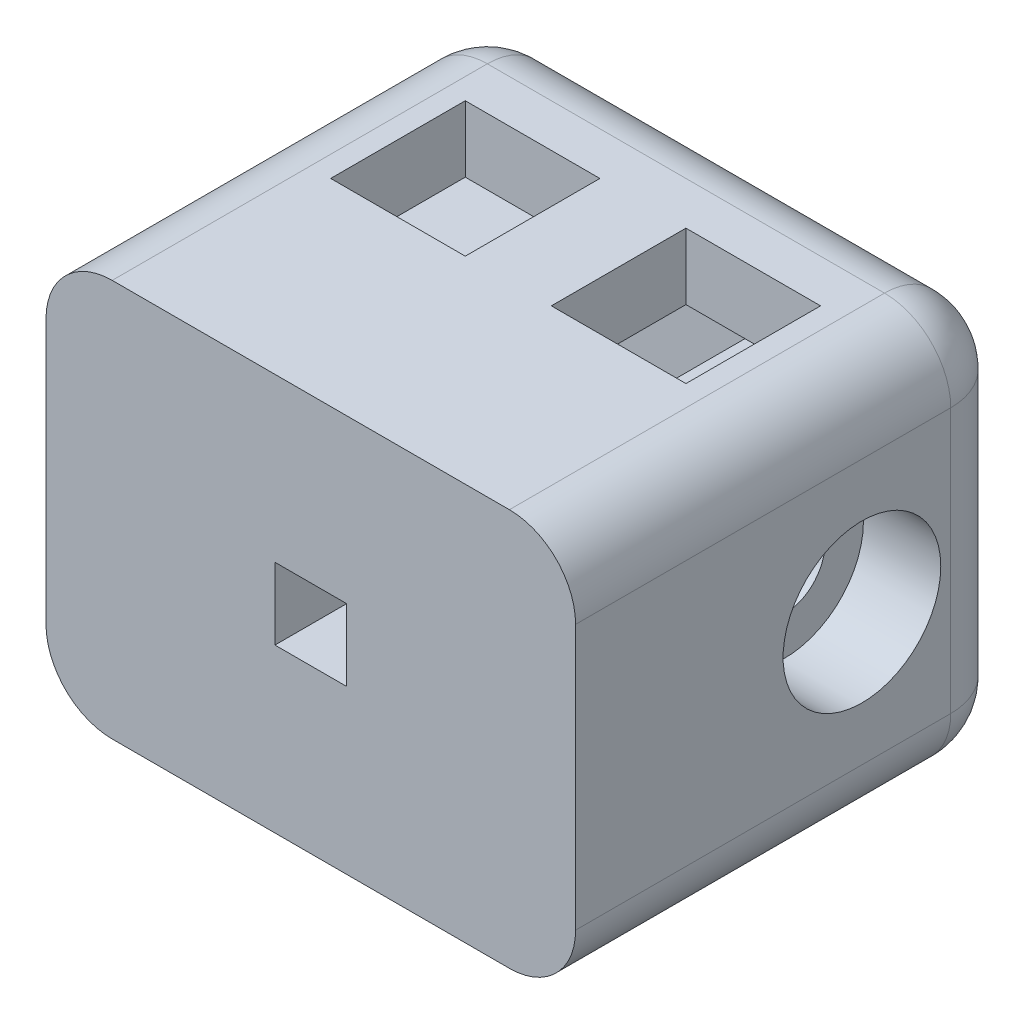
ISO-10303-21;
HEADER;
FILE_DESCRIPTION(('STEP AP214'),'2;1');
FILE_NAME('part.step','',(''),(''),'','','');
FILE_SCHEMA(('AUTOMOTIVE_DESIGN { 1 0 10303 214 1 1 1 1 }'));
ENDSEC;
DATA;
#1=APPLICATION_CONTEXT('core data for automotive mechanical design processes');
#2=APPLICATION_PROTOCOL_DEFINITION('international standard','automotive_design',2000,#1);
#3=PRODUCT_CONTEXT('',#1,'mechanical');
#4=PRODUCT('Part','Part','',(#3));
#5=PRODUCT_RELATED_PRODUCT_CATEGORY('part','',(#4));
#6=PRODUCT_DEFINITION_FORMATION('','',#4);
#7=PRODUCT_DEFINITION_CONTEXT('part definition',#1,'design');
#8=PRODUCT_DEFINITION('design','',#6,#7);
#9=PRODUCT_DEFINITION_SHAPE('','',#8);
#10=(LENGTH_UNIT() NAMED_UNIT(*) SI_UNIT(.MILLI.,.METRE.));
#11=(NAMED_UNIT(*) PLANE_ANGLE_UNIT() SI_UNIT($,.RADIAN.));
#12=(NAMED_UNIT(*) SI_UNIT($,.STERADIAN.) SOLID_ANGLE_UNIT());
#13=UNCERTAINTY_MEASURE_WITH_UNIT(LENGTH_MEASURE(1.E-05),#10,'distance_accuracy_value','');
#14=(GEOMETRIC_REPRESENTATION_CONTEXT(3) GLOBAL_UNCERTAINTY_ASSIGNED_CONTEXT((#13)) GLOBAL_UNIT_ASSIGNED_CONTEXT((#10,
#11,#12)) REPRESENTATION_CONTEXT('',''));
#15=CARTESIAN_POINT('',(0.,0.,0.));
#16=DIRECTION('',(0.,0.,1.));
#17=DIRECTION('',(1.,0.,0.));
#18=AXIS2_PLACEMENT_3D('',#15,#16,#17);
#19=CARTESIAN_POINT('',(0.,6.,0.));
#20=DIRECTION('',(0.,-1.,0.));
#21=DIRECTION('',(0.,0.,-1.));
#22=AXIS2_PLACEMENT_3D('',#19,#20,#21);
#23=PLANE('',#22);
#24=DIRECTION('',(0.,0.,1.));
#25=VECTOR('',#24,1.);
#26=CARTESIAN_POINT('',(-4.625,6.,2.95));
#27=LINE('',#26,#25);
#28=CARTESIAN_POINT('',(-4.625,6.,4.95));
#29=VERTEX_POINT('',#28);
#30=CARTESIAN_POINT('',(-4.625,6.,11.05));
#31=VERTEX_POINT('',#30);
#32=EDGE_CURVE('E231',#29,#31,#27,.T.);
#33=ORIENTED_EDGE('',*,*,#32,.F.);
#34=DIRECTION('',(-1.,0.,0.));
#35=VECTOR('',#34,1.);
#36=CARTESIAN_POINT('',(-8.05,6.,4.95));
#37=LINE('',#36,#35);
#38=CARTESIAN_POINT('',(-8.05,6.,4.95));
#39=VERTEX_POINT('',#38);
#40=EDGE_CURVE('E279',#29,#39,#37,.T.);
#41=ORIENTED_EDGE('',*,*,#40,.T.);
#42=DIRECTION('',(0.,0.,1.));
#43=VECTOR('',#42,1.);
#44=CARTESIAN_POINT('',(-8.05,6.,11.05));
#45=LINE('',#44,#43);
#46=CARTESIAN_POINT('',(-8.05,6.,11.05));
#47=VERTEX_POINT('',#46);
#48=EDGE_CURVE('E288',#39,#47,#45,.T.);
#49=ORIENTED_EDGE('',*,*,#48,.T.);
#50=DIRECTION('',(1.,0.,0.));
#51=VECTOR('',#50,1.);
#52=CARTESIAN_POINT('',(-8.05,6.,11.05));
#53=LINE('',#52,#51);
#54=EDGE_CURVE('E291',#47,#31,#53,.T.);
#55=ORIENTED_EDGE('',*,*,#54,.T.);
#56=EDGE_LOOP('',(#33,#41,#49,#55));
#57=FACE_BOUND('',#56,.T.);
#58=ADVANCED_FACE('F39',(#57),#23,.F.);
#59=CARTESIAN_POINT('',(0.,-9.,20.));
#60=DIRECTION('',(0.,1.,0.));
#61=DIRECTION('',(-1.,0.,0.));
#62=AXIS2_PLACEMENT_3D('',#59,#60,#61);
#63=PLANE('',#62);
#64=DIRECTION('',(1.,0.,0.));
#65=VECTOR('',#64,1.);
#66=CARTESIAN_POINT('',(0.,-9.,3.));
#67=LINE('',#66,#65);
#68=CARTESIAN_POINT('',(-9.,-9.,3.));
#69=VERTEX_POINT('',#68);
#70=CARTESIAN_POINT('',(-4.625,-9.,3.));
#71=VERTEX_POINT('',#70);
#72=EDGE_CURVE('E249',#69,#71,#67,.T.);
#73=ORIENTED_EDGE('',*,*,#72,.T.);
#74=DIRECTION('',(0.,0.,1.));
#75=VECTOR('',#74,1.);
#76=CARTESIAN_POINT('',(-4.625,-9.,2.95));
#77=LINE('',#76,#75);
#78=CARTESIAN_POINT('',(-4.625,-9.,11.05));
#79=VERTEX_POINT('',#78);
#80=EDGE_CURVE('E228',#71,#79,#77,.T.);
#81=ORIENTED_EDGE('',*,*,#80,.T.);
#82=DIRECTION('',(1.,0.,0.));
#83=VECTOR('',#82,1.);
#84=CARTESIAN_POINT('',(-4.625,-9.,11.05));
#85=LINE('',#84,#83);
#86=CARTESIAN_POINT('',(4.625,-9.,11.05));
#87=VERTEX_POINT('',#86);
#88=EDGE_CURVE('E238',#79,#87,#85,.T.);
#89=ORIENTED_EDGE('',*,*,#88,.T.);
#90=DIRECTION('',(0.,0.,-1.));
#91=VECTOR('',#90,1.);
#92=CARTESIAN_POINT('',(4.625,-9.,2.95));
#93=LINE('',#92,#91);
#94=CARTESIAN_POINT('',(4.625,-9.,3.));
#95=VERTEX_POINT('',#94);
#96=EDGE_CURVE('E235',#87,#95,#93,.T.);
#97=ORIENTED_EDGE('',*,*,#96,.T.);
#98=CARTESIAN_POINT('',(9.,-9.,3.));
#99=VERTEX_POINT('',#98);
#100=EDGE_CURVE('E558',#95,#99,#67,.T.);
#101=ORIENTED_EDGE('',*,*,#100,.T.);
#102=DIRECTION('',(0.,0.,-1.));
#103=VECTOR('',#102,1.);
#104=CARTESIAN_POINT('',(9.,-9.,20.));
#105=LINE('',#104,#103);
#106=CARTESIAN_POINT('',(9.,-9.,20.));
#107=VERTEX_POINT('',#106);
#108=EDGE_CURVE('E562',#99,#107,#105,.F.);
#109=ORIENTED_EDGE('',*,*,#108,.T.);
#110=DIRECTION('',(1.,0.,0.));
#111=VECTOR('',#110,1.);
#112=CARTESIAN_POINT('',(0.,-9.,20.));
#113=LINE('',#112,#111);
#114=CARTESIAN_POINT('',(-9.,-9.,20.));
#115=VERTEX_POINT('',#114);
#116=EDGE_CURVE('E626',#115,#107,#113,.T.);
#117=ORIENTED_EDGE('',*,*,#116,.F.);
#118=DIRECTION('',(0.,0.,-1.));
#119=VECTOR('',#118,1.);
#120=CARTESIAN_POINT('',(-9.,-9.,0.));
#121=LINE('',#120,#119);
#122=EDGE_CURVE('E599',#115,#69,#121,.T.);
#123=ORIENTED_EDGE('',*,*,#122,.T.);
#124=EDGE_LOOP('',(#73,#81,#89,#97,#101,#109,#117,#123));
#125=FACE_BOUND('',#124,.T.);
#126=ADVANCED_FACE('F247',(#125),#63,.F.);
#127=CARTESIAN_POINT('',(12.,0.,20.));
#128=DIRECTION('',(-1.,0.,0.));
#129=DIRECTION('',(0.,0.,1.));
#130=AXIS2_PLACEMENT_3D('',#127,#128,#129);
#131=PLANE('',#130);
#132=CARTESIAN_POINT('',(12.,0.,7.025));
#133=DIRECTION('',(1.,0.,0.));
#134=DIRECTION('',(0.,0.,-1.));
#135=AXIS2_PLACEMENT_3D('',#132,#133,#134);
#136=CIRCLE('',#135,3.57250999999999);
#137=CARTESIAN_POINT('',(12.,0.,3.45249000000001));
#138=VERTEX_POINT('',#137);
#139=EDGE_CURVE('E707',#138,#138,#136,.T.);
#140=ORIENTED_EDGE('',*,*,#139,.F.);
#141=EDGE_LOOP('',(#140));
#142=FACE_BOUND('',#141,.T.);
#143=DIRECTION('',(0.,1.,0.));
#144=VECTOR('',#143,1.);
#145=CARTESIAN_POINT('',(12.,0.,20.));
#146=LINE('',#145,#144);
#147=CARTESIAN_POINT('',(12.,-6.,20.));
#148=VERTEX_POINT('',#147);
#149=CARTESIAN_POINT('',(12.,6.,20.));
#150=VERTEX_POINT('',#149);
#151=EDGE_CURVE('E605',#148,#150,#146,.T.);
#152=ORIENTED_EDGE('',*,*,#151,.F.);
#153=DIRECTION('',(0.,0.,-1.));
#154=VECTOR('',#153,1.);
#155=CARTESIAN_POINT('',(12.,-6.,20.));
#156=LINE('',#155,#154);
#157=CARTESIAN_POINT('',(12.,-6.,3.));
#158=VERTEX_POINT('',#157);
#159=EDGE_CURVE('E580',#148,#158,#156,.T.);
#160=ORIENTED_EDGE('',*,*,#159,.T.);
#161=DIRECTION('',(0.,1.,0.));
#162=VECTOR('',#161,1.);
#163=CARTESIAN_POINT('',(12.,0.,3.));
#164=LINE('',#163,#162);
#165=CARTESIAN_POINT('',(12.,6.,3.));
#166=VERTEX_POINT('',#165);
#167=EDGE_CURVE('E577',#158,#166,#164,.T.);
#168=ORIENTED_EDGE('',*,*,#167,.T.);
#169=DIRECTION('',(0.,0.,-1.));
#170=VECTOR('',#169,1.);
#171=CARTESIAN_POINT('',(12.,6.,20.));
#172=LINE('',#171,#170);
#173=EDGE_CURVE('E581',#166,#150,#172,.F.);
#174=ORIENTED_EDGE('',*,*,#173,.T.);
#175=EDGE_LOOP('',(#152,#160,#168,#174));
#176=FACE_BOUND('',#175,.T.);
#177=ADVANCED_FACE('F391',(#142,#176),#131,.F.);
#178=CARTESIAN_POINT('',(0.,9.,20.));
#179=DIRECTION('',(0.,1.,0.));
#180=DIRECTION('',(-1.,0.,0.));
#181=AXIS2_PLACEMENT_3D('',#178,#179,#180);
#182=PLANE('',#181);
#183=DIRECTION('',(0.,0.,-1.));
#184=VECTOR('',#183,1.);
#185=CARTESIAN_POINT('',(8.05,9.,11.05));
#186=LINE('',#185,#184);
#187=CARTESIAN_POINT('',(8.05,9.,11.05));
#188=VERTEX_POINT('',#187);
#189=CARTESIAN_POINT('',(8.05,9.,4.95));
#190=VERTEX_POINT('',#189);
#191=EDGE_CURVE('E322',#188,#190,#186,.T.);
#192=ORIENTED_EDGE('',*,*,#191,.F.);
#193=DIRECTION('',(1.,0.,0.));
#194=VECTOR('',#193,1.);
#195=CARTESIAN_POINT('',(8.05,9.,11.05));
#196=LINE('',#195,#194);
#197=CARTESIAN_POINT('',(1.95,9.,11.05));
#198=VERTEX_POINT('',#197);
#199=EDGE_CURVE('E327',#198,#188,#196,.T.);
#200=ORIENTED_EDGE('',*,*,#199,.F.);
#201=DIRECTION('',(0.,0.,1.));
#202=VECTOR('',#201,1.);
#203=CARTESIAN_POINT('',(1.95,9.,11.05));
#204=LINE('',#203,#202);
#205=CARTESIAN_POINT('',(1.95,9.,4.95));
#206=VERTEX_POINT('',#205);
#207=EDGE_CURVE('E337',#206,#198,#204,.T.);
#208=ORIENTED_EDGE('',*,*,#207,.F.);
#209=DIRECTION('',(-1.,0.,0.));
#210=VECTOR('',#209,1.);
#211=CARTESIAN_POINT('',(8.05,9.,4.95));
#212=LINE('',#211,#210);
#213=EDGE_CURVE('E334',#190,#206,#212,.T.);
#214=ORIENTED_EDGE('',*,*,#213,.F.);
#215=EDGE_LOOP('',(#192,#200,#208,#214));
#216=FACE_BOUND('',#215,.T.);
#217=DIRECTION('',(0.,0.,-1.));
#218=VECTOR('',#217,1.);
#219=CARTESIAN_POINT('',(-1.95,9.,11.05));
#220=LINE('',#219,#218);
#221=CARTESIAN_POINT('',(-1.95,9.,11.05));
#222=VERTEX_POINT('',#221);
#223=CARTESIAN_POINT('',(-1.95,9.,4.95));
#224=VERTEX_POINT('',#223);
#225=EDGE_CURVE('E294',#222,#224,#220,.T.);
#226=ORIENTED_EDGE('',*,*,#225,.F.);
#227=DIRECTION('',(1.,0.,0.));
#228=VECTOR('',#227,1.);
#229=CARTESIAN_POINT('',(-8.05,9.,11.05));
#230=LINE('',#229,#228);
#231=CARTESIAN_POINT('',(-8.05,9.,11.05));
#232=VERTEX_POINT('',#231);
#233=EDGE_CURVE('E280',#232,#222,#230,.T.);
#234=ORIENTED_EDGE('',*,*,#233,.F.);
#235=DIRECTION('',(0.,0.,1.));
#236=VECTOR('',#235,1.);
#237=CARTESIAN_POINT('',(-8.05,9.,11.05));
#238=LINE('',#237,#236);
#239=CARTESIAN_POINT('',(-8.05,9.,4.95));
#240=VERTEX_POINT('',#239);
#241=EDGE_CURVE('E664',#240,#232,#238,.T.);
#242=ORIENTED_EDGE('',*,*,#241,.F.);
#243=DIRECTION('',(-1.,0.,0.));
#244=VECTOR('',#243,1.);
#245=CARTESIAN_POINT('',(-8.05,9.,4.95));
#246=LINE('',#245,#244);
#247=EDGE_CURVE('E666',#224,#240,#246,.T.);
#248=ORIENTED_EDGE('',*,*,#247,.F.);
#249=EDGE_LOOP('',(#226,#234,#242,#248));
#250=FACE_BOUND('',#249,.T.);
#251=DIRECTION('',(1.,0.,0.));
#252=VECTOR('',#251,1.);
#253=CARTESIAN_POINT('',(-12.,9.,3.));
#254=LINE('',#253,#252);
#255=CARTESIAN_POINT('',(9.,9.,3.));
#256=VERTEX_POINT('',#255);
#257=CARTESIAN_POINT('',(-9.,9.,3.));
#258=VERTEX_POINT('',#257);
#259=EDGE_CURVE('E509',#256,#258,#254,.F.);
#260=ORIENTED_EDGE('',*,*,#259,.T.);
#261=DIRECTION('',(0.,0.,-1.));
#262=VECTOR('',#261,1.);
#263=CARTESIAN_POINT('',(-9.,9.,20.));
#264=LINE('',#263,#262);
#265=CARTESIAN_POINT('',(-9.,9.,20.));
#266=VERTEX_POINT('',#265);
#267=EDGE_CURVE('E492',#258,#266,#264,.F.);
#268=ORIENTED_EDGE('',*,*,#267,.T.);
#269=DIRECTION('',(1.,0.,0.));
#270=VECTOR('',#269,1.);
#271=CARTESIAN_POINT('',(0.,9.,20.));
#272=LINE('',#271,#270);
#273=CARTESIAN_POINT('',(9.,9.,20.));
#274=VERTEX_POINT('',#273);
#275=EDGE_CURVE('E603',#266,#274,#272,.T.);
#276=ORIENTED_EDGE('',*,*,#275,.T.);
#277=DIRECTION('',(0.,0.,-1.));
#278=VECTOR('',#277,1.);
#279=CARTESIAN_POINT('',(9.,9.,0.));
#280=LINE('',#279,#278);
#281=EDGE_CURVE('E502',#274,#256,#280,.T.);
#282=ORIENTED_EDGE('',*,*,#281,.T.);
#283=EDGE_LOOP('',(#260,#268,#276,#282));
#284=FACE_BOUND('',#283,.T.);
#285=ADVANCED_FACE('F369',(#216,#250,#284),#182,.T.);
#286=CARTESIAN_POINT('',(-1.625,0.,20.));
#287=DIRECTION('',(1.,0.,0.));
#288=DIRECTION('',(0.,0.,-1.));
#289=AXIS2_PLACEMENT_3D('',#286,#287,#288);
#290=PLANE('',#289);
#291=DIRECTION('',(0.,-1.,0.));
#292=VECTOR('',#291,1.);
#293=CARTESIAN_POINT('',(-1.625,0.,11.05));
#294=LINE('',#293,#292);
#295=CARTESIAN_POINT('',(-1.625,1.625,11.05));
#296=VERTEX_POINT('',#295);
#297=CARTESIAN_POINT('',(-1.625,-1.625,11.05));
#298=VERTEX_POINT('',#297);
#299=EDGE_CURVE('E320',#296,#298,#294,.T.);
#300=ORIENTED_EDGE('',*,*,#299,.F.);
#301=DIRECTION('',(0.,0.,-1.));
#302=VECTOR('',#301,1.);
#303=CARTESIAN_POINT('',(-1.625,1.625,20.));
#304=LINE('',#303,#302);
#305=CARTESIAN_POINT('',(-1.625,1.625,20.));
#306=VERTEX_POINT('',#305);
#307=EDGE_CURVE('E585',#306,#296,#304,.T.);
#308=ORIENTED_EDGE('',*,*,#307,.F.);
#309=DIRECTION('',(0.,-1.,0.));
#310=VECTOR('',#309,1.);
#311=CARTESIAN_POINT('',(-1.625,0.,20.));
#312=LINE('',#311,#310);
#313=CARTESIAN_POINT('',(-1.625,-1.625,20.));
#314=VERTEX_POINT('',#313);
#315=EDGE_CURVE('E545',#306,#314,#312,.T.);
#316=ORIENTED_EDGE('',*,*,#315,.T.);
#317=DIRECTION('',(0.,0.,-1.));
#318=VECTOR('',#317,1.);
#319=CARTESIAN_POINT('',(-1.625,-1.625,20.));
#320=LINE('',#319,#318);
#321=EDGE_CURVE('E636',#314,#298,#320,.T.);
#322=ORIENTED_EDGE('',*,*,#321,.T.);
#323=EDGE_LOOP('',(#300,#308,#316,#322));
#324=FACE_BOUND('',#323,.T.);
#325=ADVANCED_FACE('F424',(#324),#290,.T.);
#326=CARTESIAN_POINT('',(0.,1.625,20.));
#327=DIRECTION('',(0.,1.,0.));
#328=DIRECTION('',(0.,0.,1.));
#329=AXIS2_PLACEMENT_3D('',#326,#327,#328);
#330=PLANE('',#329);
#331=ORIENTED_EDGE('',*,*,#307,.T.);
#332=DIRECTION('',(1.,0.,0.));
#333=VECTOR('',#332,1.);
#334=CARTESIAN_POINT('',(0.,1.625,11.05));
#335=LINE('',#334,#333);
#336=CARTESIAN_POINT('',(1.625,1.625,11.05));
#337=VERTEX_POINT('',#336);
#338=EDGE_CURVE('E317',#296,#337,#335,.T.);
#339=ORIENTED_EDGE('',*,*,#338,.T.);
#340=DIRECTION('',(0.,0.,-1.));
#341=VECTOR('',#340,1.);
#342=CARTESIAN_POINT('',(1.625,1.625,20.));
#343=LINE('',#342,#341);
#344=CARTESIAN_POINT('',(1.625,1.625,20.));
#345=VERTEX_POINT('',#344);
#346=EDGE_CURVE('E642',#345,#337,#343,.T.);
#347=ORIENTED_EDGE('',*,*,#346,.F.);
#348=DIRECTION('',(1.,0.,0.));
#349=VECTOR('',#348,1.);
#350=CARTESIAN_POINT('',(0.,1.625,20.));
#351=LINE('',#350,#349);
#352=EDGE_CURVE('E647',#306,#345,#351,.T.);
#353=ORIENTED_EDGE('',*,*,#352,.F.);
#354=EDGE_LOOP('',(#331,#339,#347,#353));
#355=FACE_BOUND('',#354,.T.);
#356=ADVANCED_FACE('F434',(#355),#330,.F.);
#357=CARTESIAN_POINT('',(1.625,0.,20.));
#358=DIRECTION('',(1.,0.,0.));
#359=DIRECTION('',(0.,1.,0.));
#360=AXIS2_PLACEMENT_3D('',#357,#358,#359);
#361=PLANE('',#360);
#362=ORIENTED_EDGE('',*,*,#346,.T.);
#363=DIRECTION('',(0.,-1.,0.));
#364=VECTOR('',#363,1.);
#365=CARTESIAN_POINT('',(1.625,0.,11.05));
#366=LINE('',#365,#364);
#367=CARTESIAN_POINT('',(1.625,-1.625,11.05));
#368=VERTEX_POINT('',#367);
#369=EDGE_CURVE('E310',#337,#368,#366,.T.);
#370=ORIENTED_EDGE('',*,*,#369,.T.);
#371=DIRECTION('',(0.,0.,-1.));
#372=VECTOR('',#371,1.);
#373=CARTESIAN_POINT('',(1.625,-1.625,20.));
#374=LINE('',#373,#372);
#375=CARTESIAN_POINT('',(1.625,-1.625,20.));
#376=VERTEX_POINT('',#375);
#377=EDGE_CURVE('E639',#376,#368,#374,.T.);
#378=ORIENTED_EDGE('',*,*,#377,.F.);
#379=DIRECTION('',(0.,-1.,0.));
#380=VECTOR('',#379,1.);
#381=CARTESIAN_POINT('',(1.625,0.,20.));
#382=LINE('',#381,#380);
#383=EDGE_CURVE('E631',#345,#376,#382,.T.);
#384=ORIENTED_EDGE('',*,*,#383,.F.);
#385=EDGE_LOOP('',(#362,#370,#378,#384));
#386=FACE_BOUND('',#385,.T.);
#387=ADVANCED_FACE('F430',(#386),#361,.F.);
#388=CARTESIAN_POINT('',(0.,-1.625,20.));
#389=DIRECTION('',(0.,1.,0.));
#390=DIRECTION('',(0.,0.,1.));
#391=AXIS2_PLACEMENT_3D('',#388,#389,#390);
#392=PLANE('',#391);
#393=DIRECTION('',(1.,0.,0.));
#394=VECTOR('',#393,1.);
#395=CARTESIAN_POINT('',(0.,-1.625,11.05));
#396=LINE('',#395,#394);
#397=EDGE_CURVE('E11',#298,#368,#396,.T.);
#398=ORIENTED_EDGE('',*,*,#397,.F.);
#399=ORIENTED_EDGE('',*,*,#321,.F.);
#400=DIRECTION('',(1.,0.,0.));
#401=VECTOR('',#400,1.);
#402=CARTESIAN_POINT('',(0.,-1.625,20.));
#403=LINE('',#402,#401);
#404=EDGE_CURVE('E627',#314,#376,#403,.T.);
#405=ORIENTED_EDGE('',*,*,#404,.T.);
#406=ORIENTED_EDGE('',*,*,#377,.T.);
#407=EDGE_LOOP('',(#398,#399,#405,#406));
#408=FACE_BOUND('',#407,.T.);
#409=ADVANCED_FACE('F420',(#408),#392,.T.);
#410=CARTESIAN_POINT('',(-12.,0.,20.));
#411=DIRECTION('',(-1.,0.,0.));
#412=DIRECTION('',(0.,-1.,0.));
#413=AXIS2_PLACEMENT_3D('',#410,#411,#412);
#414=PLANE('',#413);
#415=CARTESIAN_POINT('',(-12.,0.,7.025));
#416=DIRECTION('',(1.,0.,0.));
#417=DIRECTION('',(0.,0.,-1.));
#418=AXIS2_PLACEMENT_3D('',#415,#416,#417);
#419=CIRCLE('',#418,1.82879999999999);
#420=CARTESIAN_POINT('',(-12.,0.,5.19620000000001));
#421=VERTEX_POINT('',#420);
#422=EDGE_CURVE('E696',#421,#421,#419,.T.);
#423=ORIENTED_EDGE('',*,*,#422,.T.);
#424=EDGE_LOOP('',(#423));
#425=FACE_BOUND('',#424,.T.);
#426=DIRECTION('',(0.,1.,0.));
#427=VECTOR('',#426,1.);
#428=CARTESIAN_POINT('',(-12.,-9.,3.));
#429=LINE('',#428,#427);
#430=CARTESIAN_POINT('',(-12.,6.,3.));
#431=VERTEX_POINT('',#430);
#432=CARTESIAN_POINT('',(-12.,-6.,3.));
#433=VERTEX_POINT('',#432);
#434=EDGE_CURVE('E596',#431,#433,#429,.F.);
#435=ORIENTED_EDGE('',*,*,#434,.T.);
#436=DIRECTION('',(0.,0.,-1.));
#437=VECTOR('',#436,1.);
#438=CARTESIAN_POINT('',(-12.,-6.,20.));
#439=LINE('',#438,#437);
#440=CARTESIAN_POINT('',(-12.,-6.,20.));
#441=VERTEX_POINT('',#440);
#442=EDGE_CURVE('E569',#433,#441,#439,.F.);
#443=ORIENTED_EDGE('',*,*,#442,.T.);
#444=DIRECTION('',(0.,1.,0.));
#445=VECTOR('',#444,1.);
#446=CARTESIAN_POINT('',(-12.,0.,20.));
#447=LINE('',#446,#445);
#448=CARTESIAN_POINT('',(-12.,6.,20.));
#449=VERTEX_POINT('',#448);
#450=EDGE_CURVE('E610',#441,#449,#447,.T.);
#451=ORIENTED_EDGE('',*,*,#450,.T.);
#452=DIRECTION('',(0.,0.,-1.));
#453=VECTOR('',#452,1.);
#454=CARTESIAN_POINT('',(-12.,6.,20.));
#455=LINE('',#454,#453);
#456=EDGE_CURVE('E494',#449,#431,#455,.T.);
#457=ORIENTED_EDGE('',*,*,#456,.T.);
#458=EDGE_LOOP('',(#435,#443,#451,#457));
#459=FACE_BOUND('',#458,.T.);
#460=ADVANCED_FACE('F413',(#425,#459),#414,.T.);
#461=CARTESIAN_POINT('',(0.,0.,20.));
#462=DIRECTION('',(0.,0.,1.));
#463=DIRECTION('',(1.,0.,0.));
#464=AXIS2_PLACEMENT_3D('',#461,#462,#463);
#465=PLANE('',#464);
#466=ORIENTED_EDGE('',*,*,#315,.F.);
#467=ORIENTED_EDGE('',*,*,#352,.T.);
#468=ORIENTED_EDGE('',*,*,#383,.T.);
#469=ORIENTED_EDGE('',*,*,#404,.F.);
#470=EDGE_LOOP('',(#466,#467,#468,#469));
#471=FACE_BOUND('',#470,.T.);
#472=ORIENTED_EDGE('',*,*,#450,.F.);
#473=CARTESIAN_POINT('',(-9.,-6.,20.));
#474=DIRECTION('',(0.,0.,1.));
#475=DIRECTION('',(1.,0.,0.));
#476=AXIS2_PLACEMENT_3D('',#473,#474,#475);
#477=CIRCLE('',#476,3.);
#478=EDGE_CURVE('E499',#441,#115,#477,.T.);
#479=ORIENTED_EDGE('',*,*,#478,.T.);
#480=ORIENTED_EDGE('',*,*,#116,.T.);
#481=CARTESIAN_POINT('',(9.,-6.,20.));
#482=DIRECTION('',(0.,0.,1.));
#483=DIRECTION('',(1.,0.,0.));
#484=AXIS2_PLACEMENT_3D('',#481,#482,#483);
#485=CIRCLE('',#484,3.);
#486=EDGE_CURVE('E500',#107,#148,#485,.T.);
#487=ORIENTED_EDGE('',*,*,#486,.T.);
#488=ORIENTED_EDGE('',*,*,#151,.T.);
#489=CARTESIAN_POINT('',(9.,6.,20.));
#490=DIRECTION('',(0.,0.,1.));
#491=DIRECTION('',(1.,0.,0.));
#492=AXIS2_PLACEMENT_3D('',#489,#490,#491);
#493=CIRCLE('',#492,3.);
#494=EDGE_CURVE('E504',#150,#274,#493,.T.);
#495=ORIENTED_EDGE('',*,*,#494,.T.);
#496=ORIENTED_EDGE('',*,*,#275,.F.);
#497=CARTESIAN_POINT('',(-9.,6.,20.));
#498=DIRECTION('',(0.,0.,1.));
#499=DIRECTION('',(1.,0.,0.));
#500=AXIS2_PLACEMENT_3D('',#497,#498,#499);
#501=CIRCLE('',#500,3.);
#502=EDGE_CURVE('E490',#266,#449,#501,.T.);
#503=ORIENTED_EDGE('',*,*,#502,.T.);
#504=EDGE_LOOP('',(#472,#479,#480,#487,#488,#495,#496,#503));
#505=FACE_BOUND('',#504,.T.);
#506=ADVANCED_FACE('F409',(#471,#505),#465,.T.);
#507=CARTESIAN_POINT('',(0.,0.,0.));
#508=DIRECTION('',(0.,0.,1.));
#509=DIRECTION('',(1.,0.,0.));
#510=AXIS2_PLACEMENT_3D('',#507,#508,#509);
#511=PLANE('',#510);
#512=DIRECTION('',(0.,1.,0.));
#513=VECTOR('',#512,1.);
#514=CARTESIAN_POINT('',(9.,0.,0.));
#515=LINE('',#514,#513);
#516=CARTESIAN_POINT('',(9.,6.,0.));
#517=VERTEX_POINT('',#516);
#518=CARTESIAN_POINT('',(9.,-6.,0.));
#519=VERTEX_POINT('',#518);
#520=EDGE_CURVE('E592',#517,#519,#515,.F.);
#521=ORIENTED_EDGE('',*,*,#520,.T.);
#522=DIRECTION('',(1.,0.,0.));
#523=VECTOR('',#522,1.);
#524=CARTESIAN_POINT('',(0.,-6.,0.));
#525=LINE('',#524,#523);
#526=CARTESIAN_POINT('',(-9.,-6.,0.));
#527=VERTEX_POINT('',#526);
#528=EDGE_CURVE('E572',#519,#527,#525,.F.);
#529=ORIENTED_EDGE('',*,*,#528,.T.);
#530=DIRECTION('',(0.,1.,0.));
#531=VECTOR('',#530,1.);
#532=CARTESIAN_POINT('',(-9.,9.,0.));
#533=LINE('',#532,#531);
#534=CARTESIAN_POINT('',(-9.,6.,0.));
#535=VERTEX_POINT('',#534);
#536=EDGE_CURVE('E590',#527,#535,#533,.T.);
#537=ORIENTED_EDGE('',*,*,#536,.T.);
#538=DIRECTION('',(1.,0.,0.));
#539=VECTOR('',#538,1.);
#540=CARTESIAN_POINT('',(12.,6.,0.));
#541=LINE('',#540,#539);
#542=EDGE_CURVE('E583',#535,#517,#541,.T.);
#543=ORIENTED_EDGE('',*,*,#542,.T.);
#544=EDGE_LOOP('',(#521,#529,#537,#543));
#545=FACE_BOUND('',#544,.T.);
#546=ADVANCED_FACE('F412',(#545),#511,.F.);
#547=CARTESIAN_POINT('',(-9.,-6.,20.));
#548=DIRECTION('',(0.,0.,1.));
#549=DIRECTION('',(1.,0.,0.));
#550=AXIS2_PLACEMENT_3D('',#547,#548,#549);
#551=CYLINDRICAL_SURFACE('',#550,3.);
#552=ORIENTED_EDGE('',*,*,#478,.F.);
#553=ORIENTED_EDGE('',*,*,#442,.F.);
#554=CARTESIAN_POINT('',(-9.,-6.,3.));
#555=DIRECTION('',(0.,0.,-1.));
#556=DIRECTION('',(-1.,0.,0.));
#557=AXIS2_PLACEMENT_3D('',#554,#555,#556);
#558=CIRCLE('',#557,3.);
#559=EDGE_CURVE('E539',#69,#433,#558,.T.);
#560=ORIENTED_EDGE('',*,*,#559,.F.);
#561=ORIENTED_EDGE('',*,*,#122,.F.);
#562=EDGE_LOOP('',(#552,#553,#560,#561));
#563=FACE_BOUND('',#562,.T.);
#564=ADVANCED_FACE('F41',(#563),#551,.T.);
#565=CARTESIAN_POINT('',(-9.,6.,20.));
#566=DIRECTION('',(0.,0.,-1.));
#567=DIRECTION('',(-1.,0.,0.));
#568=AXIS2_PLACEMENT_3D('',#565,#566,#567);
#569=CYLINDRICAL_SURFACE('',#568,3.);
#570=ORIENTED_EDGE('',*,*,#502,.F.);
#571=ORIENTED_EDGE('',*,*,#267,.F.);
#572=CARTESIAN_POINT('',(-9.,6.,3.));
#573=DIRECTION('',(0.,0.,-1.));
#574=DIRECTION('',(-1.,0.,0.));
#575=AXIS2_PLACEMENT_3D('',#572,#573,#574);
#576=CIRCLE('',#575,3.);
#577=EDGE_CURVE('E537',#431,#258,#576,.T.);
#578=ORIENTED_EDGE('',*,*,#577,.F.);
#579=ORIENTED_EDGE('',*,*,#456,.F.);
#580=EDGE_LOOP('',(#570,#571,#578,#579));
#581=FACE_BOUND('',#580,.T.);
#582=ADVANCED_FACE('F479',(#581),#569,.T.);
#583=CARTESIAN_POINT('',(-9.,0.,3.));
#584=DIRECTION('',(0.,-1.,0.));
#585=DIRECTION('',(1.,0.,0.));
#586=AXIS2_PLACEMENT_3D('',#583,#584,#585);
#587=CYLINDRICAL_SURFACE('',#586,3.);
#588=CARTESIAN_POINT('',(-9.,-6.,3.));
#589=DIRECTION('',(0.,-1.,0.));
#590=DIRECTION('',(0.,0.,-1.));
#591=AXIS2_PLACEMENT_3D('',#588,#589,#590);
#592=CIRCLE('',#591,3.);
#593=EDGE_CURVE('E542',#433,#527,#592,.T.);
#594=ORIENTED_EDGE('',*,*,#593,.F.);
#595=ORIENTED_EDGE('',*,*,#434,.F.);
#596=CARTESIAN_POINT('',(-9.,6.,3.));
#597=DIRECTION('',(0.,1.,0.));
#598=DIRECTION('',(0.,0.,1.));
#599=AXIS2_PLACEMENT_3D('',#596,#597,#598);
#600=CIRCLE('',#599,3.);
#601=EDGE_CURVE('E534',#535,#431,#600,.T.);
#602=ORIENTED_EDGE('',*,*,#601,.F.);
#603=ORIENTED_EDGE('',*,*,#536,.F.);
#604=EDGE_LOOP('',(#594,#595,#602,#603));
#605=FACE_BOUND('',#604,.T.);
#606=ADVANCED_FACE('F476',(#605),#587,.T.);
#607=CARTESIAN_POINT('',(-9.,-6.,3.));
#608=DIRECTION('',(0.,0.,1.));
#609=DIRECTION('',(1.,0.,0.));
#610=AXIS2_PLACEMENT_3D('',#607,#608,#609);
#611=SPHERICAL_SURFACE('',#610,3.);
#612=ORIENTED_EDGE('',*,*,#559,.T.);
#613=ORIENTED_EDGE('',*,*,#593,.T.);
#614=CARTESIAN_POINT('',(-9.,-6.,3.));
#615=DIRECTION('',(-1.,0.,0.));
#616=DIRECTION('',(0.,-1.,0.));
#617=AXIS2_PLACEMENT_3D('',#614,#615,#616);
#618=CIRCLE('',#617,3.);
#619=EDGE_CURVE('E531',#69,#527,#618,.F.);
#620=ORIENTED_EDGE('',*,*,#619,.F.);
#621=EDGE_LOOP('',(#612,#613,#620));
#622=FACE_BOUND('',#621,.T.);
#623=ADVANCED_FACE('F472',(#622),#611,.T.);
#624=CARTESIAN_POINT('',(-9.,6.,3.));
#625=DIRECTION('',(0.,0.,1.));
#626=DIRECTION('',(1.,0.,0.));
#627=AXIS2_PLACEMENT_3D('',#624,#625,#626);
#628=SPHERICAL_SURFACE('',#627,3.);
#629=ORIENTED_EDGE('',*,*,#601,.T.);
#630=ORIENTED_EDGE('',*,*,#577,.T.);
#631=CARTESIAN_POINT('',(-9.,6.,3.));
#632=DIRECTION('',(-1.,0.,0.));
#633=DIRECTION('',(0.,0.,1.));
#634=AXIS2_PLACEMENT_3D('',#631,#632,#633);
#635=CIRCLE('',#634,3.);
#636=EDGE_CURVE('E528',#535,#258,#635,.F.);
#637=ORIENTED_EDGE('',*,*,#636,.F.);
#638=EDGE_LOOP('',(#629,#630,#637));
#639=FACE_BOUND('',#638,.T.);
#640=ADVANCED_FACE('F468',(#639),#628,.T.);
#641=CARTESIAN_POINT('',(0.,-6.,3.));
#642=DIRECTION('',(1.,0.,0.));
#643=DIRECTION('',(0.,1.,0.));
#644=AXIS2_PLACEMENT_3D('',#641,#642,#643);
#645=CYLINDRICAL_SURFACE('',#644,3.);
#646=CARTESIAN_POINT('',(-4.625,-6.,3.));
#647=DIRECTION('',(-1.,0.,0.));
#648=DIRECTION('',(0.,0.,1.));
#649=AXIS2_PLACEMENT_3D('',#646,#647,#648);
#650=CIRCLE('',#649,3.);
#651=CARTESIAN_POINT('',(-4.625,-8.99958330439413,2.95));
#652=VERTEX_POINT('',#651);
#653=EDGE_CURVE('E48',#71,#652,#650,.F.);
#654=ORIENTED_EDGE('',*,*,#653,.F.);
#655=ORIENTED_EDGE('',*,*,#72,.F.);
#656=ORIENTED_EDGE('',*,*,#619,.T.);
#657=ORIENTED_EDGE('',*,*,#528,.F.);
#658=CARTESIAN_POINT('',(9.,-6.,3.));
#659=DIRECTION('',(1.,0.,0.));
#660=DIRECTION('',(0.,0.,-1.));
#661=AXIS2_PLACEMENT_3D('',#658,#659,#660);
#662=CIRCLE('',#661,3.);
#663=EDGE_CURVE('E525',#99,#519,#662,.T.);
#664=ORIENTED_EDGE('',*,*,#663,.F.);
#665=ORIENTED_EDGE('',*,*,#100,.F.);
#666=CARTESIAN_POINT('',(4.625,-6.,3.));
#667=DIRECTION('',(1.,0.,0.));
#668=DIRECTION('',(0.,0.,-1.));
#669=AXIS2_PLACEMENT_3D('',#666,#667,#668);
#670=CIRCLE('',#669,3.);
#671=CARTESIAN_POINT('',(4.625,-8.99958330439413,2.95));
#672=VERTEX_POINT('',#671);
#673=EDGE_CURVE('E512',#672,#95,#670,.F.);
#674=ORIENTED_EDGE('',*,*,#673,.F.);
#675=DIRECTION('',(1.,0.,0.));
#676=VECTOR('',#675,1.);
#677=CARTESIAN_POINT('',(0.,-8.99958330439413,2.95));
#678=LINE('',#677,#676);
#679=EDGE_CURVE('E547',#652,#672,#678,.T.);
#680=ORIENTED_EDGE('',*,*,#679,.F.);
#681=EDGE_LOOP('',(#654,#655,#656,#657,#664,#665,#674,#680));
#682=FACE_BOUND('',#681,.T.);
#683=ADVANCED_FACE('F464',(#682),#645,.T.);
#684=CARTESIAN_POINT('',(9.,-6.,20.));
#685=DIRECTION('',(0.,0.,-1.));
#686=DIRECTION('',(-1.,0.,0.));
#687=AXIS2_PLACEMENT_3D('',#684,#685,#686);
#688=CYLINDRICAL_SURFACE('',#687,3.);
#689=ORIENTED_EDGE('',*,*,#486,.F.);
#690=ORIENTED_EDGE('',*,*,#108,.F.);
#691=CARTESIAN_POINT('',(9.,-6.,3.));
#692=DIRECTION('',(0.,0.,-1.));
#693=DIRECTION('',(-1.,0.,0.));
#694=AXIS2_PLACEMENT_3D('',#691,#692,#693);
#695=CIRCLE('',#694,3.);
#696=EDGE_CURVE('E522',#158,#99,#695,.T.);
#697=ORIENTED_EDGE('',*,*,#696,.F.);
#698=ORIENTED_EDGE('',*,*,#159,.F.);
#699=EDGE_LOOP('',(#689,#690,#697,#698));
#700=FACE_BOUND('',#699,.T.);
#701=ADVANCED_FACE('F460',(#700),#688,.T.);
#702=CARTESIAN_POINT('',(9.,6.,20.));
#703=DIRECTION('',(0.,0.,1.));
#704=DIRECTION('',(1.,0.,0.));
#705=AXIS2_PLACEMENT_3D('',#702,#703,#704);
#706=CYLINDRICAL_SURFACE('',#705,3.);
#707=ORIENTED_EDGE('',*,*,#494,.F.);
#708=ORIENTED_EDGE('',*,*,#173,.F.);
#709=CARTESIAN_POINT('',(9.,6.,3.));
#710=DIRECTION('',(0.,0.,-1.));
#711=DIRECTION('',(-1.,0.,0.));
#712=AXIS2_PLACEMENT_3D('',#709,#710,#711);
#713=CIRCLE('',#712,3.);
#714=EDGE_CURVE('E519',#256,#166,#713,.T.);
#715=ORIENTED_EDGE('',*,*,#714,.F.);
#716=ORIENTED_EDGE('',*,*,#281,.F.);
#717=EDGE_LOOP('',(#707,#708,#715,#716));
#718=FACE_BOUND('',#717,.T.);
#719=ADVANCED_FACE('F456',(#718),#706,.T.);
#720=CARTESIAN_POINT('',(0.,6.,3.));
#721=DIRECTION('',(-1.,0.,0.));
#722=DIRECTION('',(0.,-1.,0.));
#723=AXIS2_PLACEMENT_3D('',#720,#721,#722);
#724=CYLINDRICAL_SURFACE('',#723,3.);
#725=ORIENTED_EDGE('',*,*,#636,.T.);
#726=ORIENTED_EDGE('',*,*,#259,.F.);
#727=CARTESIAN_POINT('',(9.,6.,3.));
#728=DIRECTION('',(1.,0.,0.));
#729=DIRECTION('',(0.,0.,-1.));
#730=AXIS2_PLACEMENT_3D('',#727,#728,#729);
#731=CIRCLE('',#730,3.);
#732=EDGE_CURVE('E516',#517,#256,#731,.T.);
#733=ORIENTED_EDGE('',*,*,#732,.F.);
#734=ORIENTED_EDGE('',*,*,#542,.F.);
#735=EDGE_LOOP('',(#725,#726,#733,#734));
#736=FACE_BOUND('',#735,.T.);
#737=ADVANCED_FACE('F452',(#736),#724,.T.);
#738=CARTESIAN_POINT('',(9.,-6.,3.));
#739=DIRECTION('',(0.,0.,1.));
#740=DIRECTION('',(1.,0.,0.));
#741=AXIS2_PLACEMENT_3D('',#738,#739,#740);
#742=SPHERICAL_SURFACE('',#741,3.);
#743=ORIENTED_EDGE('',*,*,#696,.T.);
#744=ORIENTED_EDGE('',*,*,#663,.T.);
#745=CARTESIAN_POINT('',(9.,-6.,3.));
#746=DIRECTION('',(0.,-1.,0.));
#747=DIRECTION('',(0.,0.,-1.));
#748=AXIS2_PLACEMENT_3D('',#745,#746,#747);
#749=CIRCLE('',#748,3.);
#750=EDGE_CURVE('E514',#158,#519,#749,.F.);
#751=ORIENTED_EDGE('',*,*,#750,.F.);
#752=EDGE_LOOP('',(#743,#744,#751));
#753=FACE_BOUND('',#752,.T.);
#754=ADVANCED_FACE('F448',(#753),#742,.T.);
#755=CARTESIAN_POINT('',(9.,6.,3.));
#756=DIRECTION('',(0.,0.,1.));
#757=DIRECTION('',(1.,0.,0.));
#758=AXIS2_PLACEMENT_3D('',#755,#756,#757);
#759=SPHERICAL_SURFACE('',#758,3.);
#760=ORIENTED_EDGE('',*,*,#732,.T.);
#761=ORIENTED_EDGE('',*,*,#714,.T.);
#762=CARTESIAN_POINT('',(9.,6.,3.));
#763=DIRECTION('',(0.,1.,0.));
#764=DIRECTION('',(0.,0.,1.));
#765=AXIS2_PLACEMENT_3D('',#762,#763,#764);
#766=CIRCLE('',#765,3.);
#767=EDGE_CURVE('E274',#517,#166,#766,.F.);
#768=ORIENTED_EDGE('',*,*,#767,.F.);
#769=EDGE_LOOP('',(#760,#761,#768));
#770=FACE_BOUND('',#769,.T.);
#771=ADVANCED_FACE('F444',(#770),#759,.T.);
#772=CARTESIAN_POINT('',(9.,0.,3.));
#773=DIRECTION('',(0.,1.,0.));
#774=DIRECTION('',(0.,0.,1.));
#775=AXIS2_PLACEMENT_3D('',#772,#773,#774);
#776=CYLINDRICAL_SURFACE('',#775,3.);
#777=ORIENTED_EDGE('',*,*,#750,.T.);
#778=ORIENTED_EDGE('',*,*,#520,.F.);
#779=ORIENTED_EDGE('',*,*,#767,.T.);
#780=ORIENTED_EDGE('',*,*,#167,.F.);
#781=EDGE_LOOP('',(#777,#778,#779,#780));
#782=FACE_BOUND('',#781,.T.);
#783=ADVANCED_FACE('F407',(#782),#776,.T.);
#784=CARTESIAN_POINT('',(-1.95,6.,11.05));
#785=DIRECTION('',(1.,0.,0.));
#786=DIRECTION('',(0.,1.,0.));
#787=AXIS2_PLACEMENT_3D('',#784,#785,#786);
#788=PLANE('',#787);
#789=ORIENTED_EDGE('',*,*,#225,.T.);
#790=DIRECTION('',(0.,1.,0.));
#791=VECTOR('',#790,1.);
#792=CARTESIAN_POINT('',(-1.95,6.,4.95));
#793=LINE('',#792,#791);
#794=CARTESIAN_POINT('',(-1.95,6.,4.95));
#795=VERTEX_POINT('',#794);
#796=EDGE_CURVE('E299',#795,#224,#793,.T.);
#797=ORIENTED_EDGE('',*,*,#796,.F.);
#798=DIRECTION('',(0.,0.,-1.));
#799=VECTOR('',#798,1.);
#800=CARTESIAN_POINT('',(-1.95,6.,11.05));
#801=LINE('',#800,#799);
#802=CARTESIAN_POINT('',(-1.95,6.,11.05));
#803=VERTEX_POINT('',#802);
#804=EDGE_CURVE('E277',#803,#795,#801,.T.);
#805=ORIENTED_EDGE('',*,*,#804,.F.);
#806=DIRECTION('',(0.,1.,0.));
#807=VECTOR('',#806,1.);
#808=CARTESIAN_POINT('',(-1.95,6.,11.05));
#809=LINE('',#808,#807);
#810=EDGE_CURVE('E272',#803,#222,#809,.T.);
#811=ORIENTED_EDGE('',*,*,#810,.T.);
#812=EDGE_LOOP('',(#789,#797,#805,#811));
#813=FACE_BOUND('',#812,.T.);
#814=ADVANCED_FACE('F397',(#813),#788,.F.);
#815=CARTESIAN_POINT('',(-8.05,6.,11.05));
#816=DIRECTION('',(0.,0.,1.));
#817=DIRECTION('',(1.,0.,0.));
#818=AXIS2_PLACEMENT_3D('',#815,#816,#817);
#819=PLANE('',#818);
#820=ORIENTED_EDGE('',*,*,#233,.T.);
#821=ORIENTED_EDGE('',*,*,#810,.F.);
#822=DIRECTION('',(1.,0.,0.));
#823=VECTOR('',#822,1.);
#824=CARTESIAN_POINT('',(-4.625,6.,11.05));
#825=LINE('',#824,#823);
#826=CARTESIAN_POINT('',(1.95,6.,11.05));
#827=VERTEX_POINT('',#826);
#828=EDGE_CURVE('E262',#803,#827,#825,.T.);
#829=ORIENTED_EDGE('',*,*,#828,.T.);
#830=DIRECTION('',(0.,1.,0.));
#831=VECTOR('',#830,1.);
#832=CARTESIAN_POINT('',(1.95,6.,11.05));
#833=LINE('',#832,#831);
#834=EDGE_CURVE('E343',#827,#198,#833,.T.);
#835=ORIENTED_EDGE('',*,*,#834,.T.);
#836=ORIENTED_EDGE('',*,*,#199,.T.);
#837=DIRECTION('',(0.,1.,0.));
#838=VECTOR('',#837,1.);
#839=CARTESIAN_POINT('',(8.05,6.,11.05));
#840=LINE('',#839,#838);
#841=CARTESIAN_POINT('',(8.05,6.,11.05));
#842=VERTEX_POINT('',#841);
#843=EDGE_CURVE('E342',#842,#188,#840,.T.);
#844=ORIENTED_EDGE('',*,*,#843,.F.);
#845=DIRECTION('',(1.,0.,0.));
#846=VECTOR('',#845,1.);
#847=CARTESIAN_POINT('',(8.05,6.,11.05));
#848=LINE('',#847,#846);
#849=CARTESIAN_POINT('',(4.625,6.,11.05));
#850=VERTEX_POINT('',#849);
#851=EDGE_CURVE('E300',#850,#842,#848,.T.);
#852=ORIENTED_EDGE('',*,*,#851,.F.);
#853=DIRECTION('',(0.,1.,0.));
#854=VECTOR('',#853,1.);
#855=CARTESIAN_POINT('',(4.625,-9.,11.05));
#856=LINE('',#855,#854);
#857=EDGE_CURVE('E64',#87,#850,#856,.T.);
#858=ORIENTED_EDGE('',*,*,#857,.F.);
#859=ORIENTED_EDGE('',*,*,#88,.F.);
#860=DIRECTION('',(0.,1.,0.));
#861=VECTOR('',#860,1.);
#862=CARTESIAN_POINT('',(-4.625,-9.,11.05));
#863=LINE('',#862,#861);
#864=EDGE_CURVE('E224',#79,#31,#863,.T.);
#865=ORIENTED_EDGE('',*,*,#864,.T.);
#866=ORIENTED_EDGE('',*,*,#54,.F.);
#867=DIRECTION('',(0.,1.,0.));
#868=VECTOR('',#867,1.);
#869=CARTESIAN_POINT('',(-8.05,6.,11.05));
#870=LINE('',#869,#868);
#871=EDGE_CURVE('E275',#47,#232,#870,.T.);
#872=ORIENTED_EDGE('',*,*,#871,.T.);
#873=EDGE_LOOP('',(#820,#821,#829,#835,#836,#844,#852,#858,#859,#865,#866,#872));
#874=FACE_BOUND('',#873,.T.);
#875=ORIENTED_EDGE('',*,*,#299,.T.);
#876=ORIENTED_EDGE('',*,*,#397,.T.);
#877=ORIENTED_EDGE('',*,*,#369,.F.);
#878=ORIENTED_EDGE('',*,*,#338,.F.);
#879=EDGE_LOOP('',(#875,#876,#877,#878));
#880=FACE_BOUND('',#879,.T.);
#881=ADVANCED_FACE('F240',(#874,#880),#819,.F.);
#882=CARTESIAN_POINT('',(-8.05,6.,11.05));
#883=DIRECTION('',(-1.,0.,0.));
#884=DIRECTION('',(0.,-1.,0.));
#885=AXIS2_PLACEMENT_3D('',#882,#883,#884);
#886=PLANE('',#885);
#887=ORIENTED_EDGE('',*,*,#241,.T.);
#888=ORIENTED_EDGE('',*,*,#871,.F.);
#889=ORIENTED_EDGE('',*,*,#48,.F.);
#890=DIRECTION('',(0.,1.,0.));
#891=VECTOR('',#890,1.);
#892=CARTESIAN_POINT('',(-8.05,6.,4.95));
#893=LINE('',#892,#891);
#894=EDGE_CURVE('E660',#39,#240,#893,.T.);
#895=ORIENTED_EDGE('',*,*,#894,.T.);
#896=EDGE_LOOP('',(#887,#888,#889,#895));
#897=FACE_BOUND('',#896,.T.);
#898=ADVANCED_FACE('F396',(#897),#886,.F.);
#899=CARTESIAN_POINT('',(-8.05,6.,4.95));
#900=DIRECTION('',(0.,0.,-1.));
#901=DIRECTION('',(-1.,0.,0.));
#902=AXIS2_PLACEMENT_3D('',#899,#900,#901);
#903=PLANE('',#902);
#904=ORIENTED_EDGE('',*,*,#247,.T.);
#905=ORIENTED_EDGE('',*,*,#894,.F.);
#906=ORIENTED_EDGE('',*,*,#40,.F.);
#907=EDGE_CURVE('E286',#795,#29,#37,.T.);
#908=ORIENTED_EDGE('',*,*,#907,.F.);
#909=ORIENTED_EDGE('',*,*,#796,.T.);
#910=EDGE_LOOP('',(#904,#905,#906,#908,#909));
#911=FACE_BOUND('',#910,.T.);
#912=ADVANCED_FACE('F400',(#911),#903,.F.);
#913=CARTESIAN_POINT('',(8.05,6.,11.05));
#914=DIRECTION('',(1.,0.,0.));
#915=DIRECTION('',(0.,1.,0.));
#916=AXIS2_PLACEMENT_3D('',#913,#914,#915);
#917=PLANE('',#916);
#918=ORIENTED_EDGE('',*,*,#191,.T.);
#919=DIRECTION('',(0.,1.,0.));
#920=VECTOR('',#919,1.);
#921=CARTESIAN_POINT('',(8.05,6.,4.95));
#922=LINE('',#921,#920);
#923=CARTESIAN_POINT('',(8.05,6.,4.95));
#924=VERTEX_POINT('',#923);
#925=EDGE_CURVE('E284',#924,#190,#922,.T.);
#926=ORIENTED_EDGE('',*,*,#925,.F.);
#927=DIRECTION('',(0.,0.,-1.));
#928=VECTOR('',#927,1.);
#929=CARTESIAN_POINT('',(8.05,6.,11.05));
#930=LINE('',#929,#928);
#931=EDGE_CURVE('E323',#842,#924,#930,.T.);
#932=ORIENTED_EDGE('',*,*,#931,.F.);
#933=ORIENTED_EDGE('',*,*,#843,.T.);
#934=EDGE_LOOP('',(#918,#926,#932,#933));
#935=FACE_BOUND('',#934,.T.);
#936=ADVANCED_FACE('F373',(#935),#917,.F.);
#937=CARTESIAN_POINT('',(1.95,6.,11.05));
#938=DIRECTION('',(-1.,0.,0.));
#939=DIRECTION('',(0.,-1.,0.));
#940=AXIS2_PLACEMENT_3D('',#937,#938,#939);
#941=PLANE('',#940);
#942=ORIENTED_EDGE('',*,*,#207,.T.);
#943=ORIENTED_EDGE('',*,*,#834,.F.);
#944=DIRECTION('',(0.,0.,1.));
#945=VECTOR('',#944,1.);
#946=CARTESIAN_POINT('',(1.95,6.,11.05));
#947=LINE('',#946,#945);
#948=CARTESIAN_POINT('',(1.95,6.,4.95));
#949=VERTEX_POINT('',#948);
#950=EDGE_CURVE('E330',#949,#827,#947,.T.);
#951=ORIENTED_EDGE('',*,*,#950,.F.);
#952=DIRECTION('',(0.,1.,0.));
#953=VECTOR('',#952,1.);
#954=CARTESIAN_POINT('',(1.95,6.,4.95));
#955=LINE('',#954,#953);
#956=EDGE_CURVE('E344',#949,#206,#955,.T.);
#957=ORIENTED_EDGE('',*,*,#956,.T.);
#958=EDGE_LOOP('',(#942,#943,#951,#957));
#959=FACE_BOUND('',#958,.T.);
#960=ADVANCED_FACE('F364',(#959),#941,.F.);
#961=CARTESIAN_POINT('',(8.05,6.,4.95));
#962=DIRECTION('',(0.,0.,-1.));
#963=DIRECTION('',(-1.,0.,0.));
#964=AXIS2_PLACEMENT_3D('',#961,#962,#963);
#965=PLANE('',#964);
#966=ORIENTED_EDGE('',*,*,#213,.T.);
#967=ORIENTED_EDGE('',*,*,#956,.F.);
#968=DIRECTION('',(-1.,0.,0.));
#969=VECTOR('',#968,1.);
#970=CARTESIAN_POINT('',(8.05,6.,4.95));
#971=LINE('',#970,#969);
#972=CARTESIAN_POINT('',(4.625,6.,4.95));
#973=VERTEX_POINT('',#972);
#974=EDGE_CURVE('E326',#973,#949,#971,.T.);
#975=ORIENTED_EDGE('',*,*,#974,.F.);
#976=EDGE_CURVE('E328',#924,#973,#971,.T.);
#977=ORIENTED_EDGE('',*,*,#976,.F.);
#978=ORIENTED_EDGE('',*,*,#925,.T.);
#979=EDGE_LOOP('',(#966,#967,#975,#977,#978));
#980=FACE_BOUND('',#979,.T.);
#981=ADVANCED_FACE('F375',(#980),#965,.F.);
#982=CARTESIAN_POINT('',(0.,6.,0.));
#983=DIRECTION('',(0.,1.,0.));
#984=DIRECTION('',(0.,0.,1.));
#985=AXIS2_PLACEMENT_3D('',#982,#983,#984);
#986=PLANE('',#985);
#987=DIRECTION('',(0.,0.,-1.));
#988=VECTOR('',#987,1.);
#989=CARTESIAN_POINT('',(4.625,6.,2.95));
#990=LINE('',#989,#988);
#991=EDGE_CURVE('E253',#850,#973,#990,.T.);
#992=ORIENTED_EDGE('',*,*,#991,.F.);
#993=ORIENTED_EDGE('',*,*,#851,.T.);
#994=ORIENTED_EDGE('',*,*,#931,.T.);
#995=ORIENTED_EDGE('',*,*,#976,.T.);
#996=EDGE_LOOP('',(#992,#993,#994,#995));
#997=FACE_BOUND('',#996,.T.);
#998=ADVANCED_FACE('F374',(#997),#986,.T.);
#999=CARTESIAN_POINT('',(-4.625,-9.,2.95));
#1000=DIRECTION('',(-1.,0.,0.));
#1001=DIRECTION('',(0.,0.,1.));
#1002=AXIS2_PLACEMENT_3D('',#999,#1000,#1001);
#1003=PLANE('',#1002);
#1004=CARTESIAN_POINT('',(-4.625,0.,7.025));
#1005=DIRECTION('',(-1.,0.,0.));
#1006=DIRECTION('',(0.,0.,1.));
#1007=AXIS2_PLACEMENT_3D('',#1004,#1005,#1006);
#1008=CIRCLE('',#1007,1.8288);
#1009=CARTESIAN_POINT('',(-4.625,0.,8.85379999999999));
#1010=VERTEX_POINT('',#1009);
#1011=EDGE_CURVE('E256',#1010,#1010,#1008,.T.);
#1012=ORIENTED_EDGE('',*,*,#1011,.T.);
#1013=EDGE_LOOP('',(#1012));
#1014=FACE_BOUND('',#1013,.T.);
#1015=ORIENTED_EDGE('',*,*,#653,.T.);
#1016=DIRECTION('',(0.,1.,0.));
#1017=VECTOR('',#1016,1.);
#1018=CARTESIAN_POINT('',(-4.625,-9.,2.95));
#1019=LINE('',#1018,#1017);
#1020=CARTESIAN_POINT('',(-4.625,6.,2.95));
#1021=VERTEX_POINT('',#1020);
#1022=EDGE_CURVE('E308',#652,#1021,#1019,.T.);
#1023=ORIENTED_EDGE('',*,*,#1022,.T.);
#1024=EDGE_CURVE('E56',#1021,#29,#27,.T.);
#1025=ORIENTED_EDGE('',*,*,#1024,.T.);
#1026=ORIENTED_EDGE('',*,*,#32,.T.);
#1027=ORIENTED_EDGE('',*,*,#864,.F.);
#1028=ORIENTED_EDGE('',*,*,#80,.F.);
#1029=EDGE_LOOP('',(#1015,#1023,#1025,#1026,#1027,#1028));
#1030=FACE_BOUND('',#1029,.T.);
#1031=ADVANCED_FACE('F226',(#1014,#1030),#1003,.F.);
#1032=CARTESIAN_POINT('',(-4.625,-9.,2.95));
#1033=DIRECTION('',(0.,0.,-1.));
#1034=DIRECTION('',(-1.,0.,0.));
#1035=AXIS2_PLACEMENT_3D('',#1032,#1033,#1034);
#1036=PLANE('',#1035);
#1037=ORIENTED_EDGE('',*,*,#679,.T.);
#1038=DIRECTION('',(0.,1.,0.));
#1039=VECTOR('',#1038,1.);
#1040=CARTESIAN_POINT('',(4.625,-9.,2.95));
#1041=LINE('',#1040,#1039);
#1042=CARTESIAN_POINT('',(4.625,6.,2.95));
#1043=VERTEX_POINT('',#1042);
#1044=EDGE_CURVE('E311',#672,#1043,#1041,.T.);
#1045=ORIENTED_EDGE('',*,*,#1044,.T.);
#1046=DIRECTION('',(-1.,0.,0.));
#1047=VECTOR('',#1046,1.);
#1048=CARTESIAN_POINT('',(-4.625,6.,2.95));
#1049=LINE('',#1048,#1047);
#1050=EDGE_CURVE('E250',#1043,#1021,#1049,.T.);
#1051=ORIENTED_EDGE('',*,*,#1050,.T.);
#1052=ORIENTED_EDGE('',*,*,#1022,.F.);
#1053=EDGE_LOOP('',(#1037,#1045,#1051,#1052));
#1054=FACE_BOUND('',#1053,.T.);
#1055=ADVANCED_FACE('F553',(#1054),#1036,.F.);
#1056=CARTESIAN_POINT('',(4.625,-9.,2.95));
#1057=DIRECTION('',(1.,0.,0.));
#1058=DIRECTION('',(0.,0.,-1.));
#1059=AXIS2_PLACEMENT_3D('',#1056,#1057,#1058);
#1060=PLANE('',#1059);
#1061=CARTESIAN_POINT('',(4.625,0.,7.025));
#1062=DIRECTION('',(1.,0.,0.));
#1063=DIRECTION('',(0.,0.,-1.));
#1064=AXIS2_PLACEMENT_3D('',#1061,#1062,#1063);
#1065=CIRCLE('',#1064,1.8288);
#1066=CARTESIAN_POINT('',(4.625,0.,5.1962));
#1067=VERTEX_POINT('',#1066);
#1068=EDGE_CURVE('E43',#1067,#1067,#1065,.T.);
#1069=ORIENTED_EDGE('',*,*,#1068,.T.);
#1070=EDGE_LOOP('',(#1069));
#1071=FACE_BOUND('',#1070,.T.);
#1072=ORIENTED_EDGE('',*,*,#673,.T.);
#1073=ORIENTED_EDGE('',*,*,#96,.F.);
#1074=ORIENTED_EDGE('',*,*,#857,.T.);
#1075=ORIENTED_EDGE('',*,*,#991,.T.);
#1076=EDGE_CURVE('E303',#973,#1043,#990,.T.);
#1077=ORIENTED_EDGE('',*,*,#1076,.T.);
#1078=ORIENTED_EDGE('',*,*,#1044,.F.);
#1079=EDGE_LOOP('',(#1072,#1073,#1074,#1075,#1077,#1078));
#1080=FACE_BOUND('',#1079,.T.);
#1081=ADVANCED_FACE('F559',(#1071,#1080),#1060,.F.);
#1082=CARTESIAN_POINT('',(0.,6.,0.));
#1083=DIRECTION('',(0.,1.,0.));
#1084=DIRECTION('',(0.,0.,1.));
#1085=AXIS2_PLACEMENT_3D('',#1082,#1083,#1084);
#1086=PLANE('',#1085);
#1087=ORIENTED_EDGE('',*,*,#804,.T.);
#1088=ORIENTED_EDGE('',*,*,#907,.T.);
#1089=ORIENTED_EDGE('',*,*,#1024,.F.);
#1090=ORIENTED_EDGE('',*,*,#1050,.F.);
#1091=ORIENTED_EDGE('',*,*,#1076,.F.);
#1092=ORIENTED_EDGE('',*,*,#974,.T.);
#1093=ORIENTED_EDGE('',*,*,#950,.T.);
#1094=ORIENTED_EDGE('',*,*,#828,.F.);
#1095=EDGE_LOOP('',(#1087,#1088,#1089,#1090,#1091,#1092,#1093,#1094));
#1096=FACE_BOUND('',#1095,.T.);
#1097=ADVANCED_FACE('F359',(#1096),#1086,.F.);
#1098=CARTESIAN_POINT('',(12.,0.,7.025));
#1099=DIRECTION('',(1.,0.,0.));
#1100=DIRECTION('',(0.,0.,-1.));
#1101=AXIS2_PLACEMENT_3D('',#1098,#1099,#1100);
#1102=CYLINDRICAL_SURFACE('',#1101,3.57250999999999);
#1103=CARTESIAN_POINT('',(8.4948,0.,7.025));
#1104=DIRECTION('',(1.,0.,0.));
#1105=DIRECTION('',(0.,0.,-1.));
#1106=AXIS2_PLACEMENT_3D('',#1103,#1104,#1105);
#1107=CIRCLE('',#1106,3.57251);
#1108=CARTESIAN_POINT('',(8.4948,0.,3.45249));
#1109=VERTEX_POINT('',#1108);
#1110=EDGE_CURVE('E702',#1109,#1109,#1107,.T.);
#1111=ORIENTED_EDGE('',*,*,#1110,.F.);
#1112=EDGE_LOOP('',(#1111));
#1113=FACE_BOUND('',#1112,.T.);
#1114=ORIENTED_EDGE('',*,*,#139,.T.);
#1115=EDGE_LOOP('',(#1114));
#1116=FACE_BOUND('',#1115,.T.);
#1117=ADVANCED_FACE('F684',(#1113,#1116),#1102,.F.);
#1118=CARTESIAN_POINT('',(8.4948,1.8288,7.025));
#1119=DIRECTION('',(-1.,0.,0.));
#1120=DIRECTION('',(0.,0.,1.));
#1121=AXIS2_PLACEMENT_3D('',#1118,#1119,#1120);
#1122=PLANE('',#1121);
#1123=CARTESIAN_POINT('',(8.4948,0.,7.025));
#1124=DIRECTION('',(1.,0.,0.));
#1125=DIRECTION('',(0.,0.,-1.));
#1126=AXIS2_PLACEMENT_3D('',#1123,#1124,#1125);
#1127=CIRCLE('',#1126,1.8288);
#1128=CARTESIAN_POINT('',(8.4948,0.,5.1962));
#1129=VERTEX_POINT('',#1128);
#1130=EDGE_CURVE('E699',#1129,#1129,#1127,.T.);
#1131=ORIENTED_EDGE('',*,*,#1130,.F.);
#1132=EDGE_LOOP('',(#1131));
#1133=FACE_BOUND('',#1132,.T.);
#1134=ORIENTED_EDGE('',*,*,#1110,.T.);
#1135=EDGE_LOOP('',(#1134));
#1136=FACE_BOUND('',#1135,.T.);
#1137=ADVANCED_FACE('F712',(#1133,#1136),#1122,.F.);
#1138=CARTESIAN_POINT('',(12.,0.,7.025));
#1139=DIRECTION('',(1.,0.,0.));
#1140=DIRECTION('',(0.,0.,-1.));
#1141=AXIS2_PLACEMENT_3D('',#1138,#1139,#1140);
#1142=CYLINDRICAL_SURFACE('',#1141,1.8288);
#1143=ORIENTED_EDGE('',*,*,#1130,.T.);
#1144=EDGE_LOOP('',(#1143));
#1145=FACE_BOUND('',#1144,.T.);
#1146=ORIENTED_EDGE('',*,*,#1068,.F.);
#1147=EDGE_LOOP('',(#1146));
#1148=FACE_BOUND('',#1147,.T.);
#1149=ADVANCED_FACE('F718',(#1145,#1148),#1142,.F.);
#1150=ORIENTED_EDGE('',*,*,#422,.F.);
#1151=EDGE_LOOP('',(#1150));
#1152=FACE_BOUND('',#1151,.T.);
#1153=ORIENTED_EDGE('',*,*,#1011,.F.);
#1154=EDGE_LOOP('',(#1153));
#1155=FACE_BOUND('',#1154,.T.);
#1156=ADVANCED_FACE('F723',(#1152,#1155),#1142,.F.);
#1157=CLOSED_SHELL('',(#58,#126,#177,#285,#325,#356,#387,#409,#460,#506,#546,#564,#582,#606,
#623,#640,#683,#701,#719,#737,#754,#771,#783,#814,#881,#898,#912,#936,#960,#981,#998,#1031,
#1055,#1081,#1097,#1117,#1137,#1149,#1156));
#1158=MANIFOLD_SOLID_BREP('B2',#1157);
#1159=ADVANCED_BREP_SHAPE_REPRESENTATION('',(#18,#1158),#14);
#1160=SHAPE_DEFINITION_REPRESENTATION(#9,#1159);
ENDSEC;
END-ISO-10303-21;
